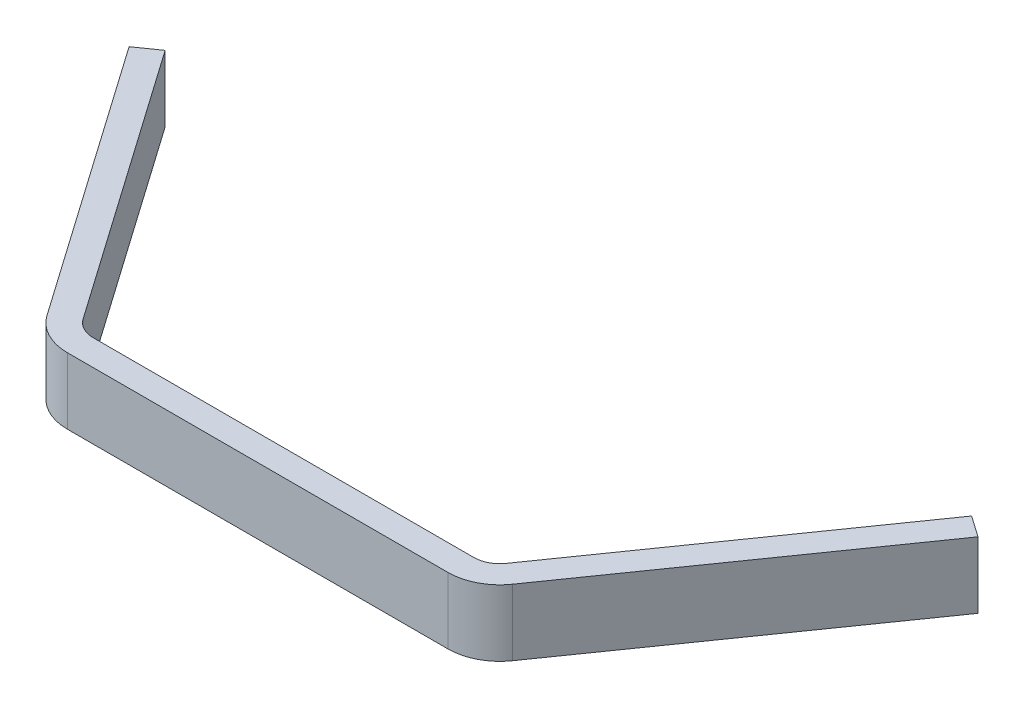
ISO-10303-21;
HEADER;
FILE_DESCRIPTION(('STEP AP214'),'2;1');
FILE_NAME('part.step','',(''),(''),'','','');
FILE_SCHEMA(('AUTOMOTIVE_DESIGN { 1 0 10303 214 1 1 1 1 }'));
ENDSEC;
DATA;
#1=APPLICATION_CONTEXT('core data for automotive mechanical design processes');
#2=APPLICATION_PROTOCOL_DEFINITION('international standard','automotive_design',2000,#1);
#3=PRODUCT_CONTEXT('',#1,'mechanical');
#4=PRODUCT('Part','Part','',(#3));
#5=PRODUCT_RELATED_PRODUCT_CATEGORY('part','',(#4));
#6=PRODUCT_DEFINITION_FORMATION('','',#4);
#7=PRODUCT_DEFINITION_CONTEXT('part definition',#1,'design');
#8=PRODUCT_DEFINITION('design','',#6,#7);
#9=PRODUCT_DEFINITION_SHAPE('','',#8);
#10=(LENGTH_UNIT() NAMED_UNIT(*) SI_UNIT(.MILLI.,.METRE.));
#11=(NAMED_UNIT(*) PLANE_ANGLE_UNIT() SI_UNIT($,.RADIAN.));
#12=(NAMED_UNIT(*) SI_UNIT($,.STERADIAN.) SOLID_ANGLE_UNIT());
#13=UNCERTAINTY_MEASURE_WITH_UNIT(LENGTH_MEASURE(1.E-05),#10,'distance_accuracy_value','');
#14=(GEOMETRIC_REPRESENTATION_CONTEXT(3) GLOBAL_UNCERTAINTY_ASSIGNED_CONTEXT((#13)) GLOBAL_UNIT_ASSIGNED_CONTEXT((#10,
#11,#12)) REPRESENTATION_CONTEXT('',''));
#15=CARTESIAN_POINT('',(0.,0.,0.));
#16=DIRECTION('',(0.,0.,1.));
#17=DIRECTION('',(1.,0.,0.));
#18=AXIS2_PLACEMENT_3D('',#15,#16,#17);
#19=CARTESIAN_POINT('',(23.3382790747957,117.704827001007,-3.175));
#20=DIRECTION('',(0.,-1.,0.));
#21=DIRECTION('',(0.,0.,-1.));
#22=AXIS2_PLACEMENT_3D('',#19,#20,#21);
#23=CYLINDRICAL_SURFACE('',#22,6.35);
#24=CARTESIAN_POINT('',(23.3382790747957,5.58800000000004,-3.175));
#25=DIRECTION('',(0.,1.,0.));
#26=DIRECTION('',(-1.,0.,0.));
#27=AXIS2_PLACEMENT_3D('',#24,#25,#26);
#28=CIRCLE('',#27,6.35);
#29=CARTESIAN_POINT('',(23.3382790747957,5.58800000000004,3.175));
#30=VERTEX_POINT('',#29);
#31=CARTESIAN_POINT('',(28.5398945560308,5.58800000000004,0.467210370829126));
#32=VERTEX_POINT('',#31);
#33=EDGE_CURVE('E140',#30,#32,#28,.T.);
#34=ORIENTED_EDGE('',*,*,#33,.F.);
#35=DIRECTION('',(0.,-1.,0.));
#36=VECTOR('',#35,1.);
#37=CARTESIAN_POINT('',(23.3382790747957,117.704827001007,3.175));
#38=LINE('',#37,#36);
#39=CARTESIAN_POINT('',(23.3382790747957,-2.53999999999997,3.175));
#40=VERTEX_POINT('',#39);
#41=EDGE_CURVE('E39',#30,#40,#38,.T.);
#42=ORIENTED_EDGE('',*,*,#41,.T.);
#43=CARTESIAN_POINT('',(23.3382790747957,-2.53999999999997,-3.175));
#44=DIRECTION('',(0.,-1.,0.));
#45=DIRECTION('',(0.,0.,-1.));
#46=AXIS2_PLACEMENT_3D('',#43,#44,#45);
#47=CIRCLE('',#46,6.35);
#48=CARTESIAN_POINT('',(28.5398945560308,-2.53999999999997,0.467210370829126));
#49=VERTEX_POINT('',#48);
#50=EDGE_CURVE('E181',#40,#49,#47,.F.);
#51=ORIENTED_EDGE('',*,*,#50,.T.);
#52=DIRECTION('',(0.,-1.,0.));
#53=VECTOR('',#52,1.);
#54=CARTESIAN_POINT('',(28.5398945560308,117.704827001007,0.467210370829126));
#55=LINE('',#54,#53);
#56=EDGE_CURVE('E145',#32,#49,#55,.T.);
#57=ORIENTED_EDGE('',*,*,#56,.F.);
#58=EDGE_LOOP('',(#34,#42,#51,#57));
#59=FACE_BOUND('',#58,.T.);
#60=ADVANCED_FACE('F35',(#59),#23,.T.);
#61=CARTESIAN_POINT('',(28.5398945560308,117.704827001007,0.467210370829126));
#62=DIRECTION('',(-0.819152044288991,0.,-0.573576436351047));
#63=DIRECTION('',(-0.573576436351047,0.,0.819152044288991));
#64=AXIS2_PLACEMENT_3D('',#61,#62,#63);
#65=PLANE('',#64);
#66=DIRECTION('',(0.573576436351047,0.,-0.819152044288991));
#67=VECTOR('',#66,1.);
#68=CARTESIAN_POINT('',(28.5398945560308,5.58800000000004,0.46721037082912));
#69=LINE('',#68,#67);
#70=CARTESIAN_POINT('',(52.0466354728892,5.58800000000004,-33.1038948145854));
#71=VERTEX_POINT('',#70);
#72=EDGE_CURVE('E137',#32,#71,#69,.T.);
#73=ORIENTED_EDGE('',*,*,#72,.F.);
#74=ORIENTED_EDGE('',*,*,#56,.T.);
#75=DIRECTION('',(0.573576436351047,0.,-0.819152044288991));
#76=VECTOR('',#75,1.);
#77=CARTESIAN_POINT('',(28.5398945560308,-2.53999999999997,0.467210370829126));
#78=LINE('',#77,#76);
#79=CARTESIAN_POINT('',(52.0466354728892,-2.53999999999997,-33.1038948145854));
#80=VERTEX_POINT('',#79);
#81=EDGE_CURVE('E207',#49,#80,#78,.T.);
#82=ORIENTED_EDGE('',*,*,#81,.T.);
#83=DIRECTION('',(0.,-1.,0.));
#84=VECTOR('',#83,1.);
#85=CARTESIAN_POINT('',(52.0466354728892,117.704827001007,-33.1038948145854));
#86=LINE('',#85,#84);
#87=EDGE_CURVE('E148',#71,#80,#86,.T.);
#88=ORIENTED_EDGE('',*,*,#87,.F.);
#89=EDGE_LOOP('',(#73,#74,#82,#88));
#90=FACE_BOUND('',#89,.T.);
#91=ADVANCED_FACE('F235',(#90),#65,.F.);
#92=CARTESIAN_POINT('',(52.0466354728892,117.704827001007,-33.1038948145854));
#93=DIRECTION('',(-0.573576436351047,0.,0.819152044288991));
#94=DIRECTION('',(0.819152044288991,0.,0.573576436351047));
#95=AXIS2_PLACEMENT_3D('',#92,#93,#94);
#96=PLANE('',#95);
#97=DIRECTION('',(-0.819152044288991,0.,-0.573576436351047));
#98=VECTOR('',#97,1.);
#99=CARTESIAN_POINT('',(52.0466354728892,5.58800000000004,-33.1038948145854));
#100=LINE('',#99,#98);
#101=CARTESIAN_POINT('',(49.4458277322716,5.58800000000004,-34.925));
#102=VERTEX_POINT('',#101);
#103=EDGE_CURVE('E134',#71,#102,#100,.T.);
#104=ORIENTED_EDGE('',*,*,#103,.F.);
#105=ORIENTED_EDGE('',*,*,#87,.T.);
#106=DIRECTION('',(-0.819152044288991,0.,-0.573576436351047));
#107=VECTOR('',#106,1.);
#108=CARTESIAN_POINT('',(52.0466354728892,-2.53999999999997,-33.1038948145854));
#109=LINE('',#108,#107);
#110=CARTESIAN_POINT('',(49.4458277322716,-2.53999999999997,-34.925));
#111=VERTEX_POINT('',#110);
#112=EDGE_CURVE('E205',#80,#111,#109,.T.);
#113=ORIENTED_EDGE('',*,*,#112,.T.);
#114=DIRECTION('',(0.,-1.,0.));
#115=VECTOR('',#114,1.);
#116=CARTESIAN_POINT('',(49.4458277322716,117.704827001007,-34.925));
#117=LINE('',#116,#115);
#118=EDGE_CURVE('E151',#102,#111,#117,.T.);
#119=ORIENTED_EDGE('',*,*,#118,.F.);
#120=EDGE_LOOP('',(#104,#105,#113,#119));
#121=FACE_BOUND('',#120,.T.);
#122=ADVANCED_FACE('F241',(#121),#96,.F.);
#123=CARTESIAN_POINT('',(25.9390868154133,117.704827001007,-1.35389481458544));
#124=DIRECTION('',(0.819152044288992,0.,0.573576436351047));
#125=DIRECTION('',(0.573576436351047,0.,-0.819152044288992));
#126=AXIS2_PLACEMENT_3D('',#123,#124,#125);
#127=PLANE('',#126);
#128=DIRECTION('',(-0.573576436351047,0.,0.819152044288992));
#129=VECTOR('',#128,1.);
#130=CARTESIAN_POINT('',(25.9390868154133,5.58800000000004,-1.35389481458544));
#131=LINE('',#130,#129);
#132=CARTESIAN_POINT('',(25.9390868154133,5.58800000000004,-1.35389481458544));
#133=VERTEX_POINT('',#132);
#134=EDGE_CURVE('E131',#102,#133,#131,.T.);
#135=ORIENTED_EDGE('',*,*,#134,.F.);
#136=ORIENTED_EDGE('',*,*,#118,.T.);
#137=DIRECTION('',(-0.573576436351047,0.,0.819152044288992));
#138=VECTOR('',#137,1.);
#139=CARTESIAN_POINT('',(25.9390868154133,-2.53999999999997,-1.35389481458544));
#140=LINE('',#139,#138);
#141=CARTESIAN_POINT('',(25.9390868154133,-2.53999999999997,-1.35389481458544));
#142=VERTEX_POINT('',#141);
#143=EDGE_CURVE('E202',#111,#142,#140,.T.);
#144=ORIENTED_EDGE('',*,*,#143,.T.);
#145=DIRECTION('',(0.,-1.,0.));
#146=VECTOR('',#145,1.);
#147=CARTESIAN_POINT('',(25.9390868154133,117.704827001007,-1.35389481458544));
#148=LINE('',#147,#146);
#149=EDGE_CURVE('E154',#133,#142,#148,.T.);
#150=ORIENTED_EDGE('',*,*,#149,.F.);
#151=EDGE_LOOP('',(#135,#136,#144,#150));
#152=FACE_BOUND('',#151,.T.);
#153=ADVANCED_FACE('F239',(#152),#127,.F.);
#154=CARTESIAN_POINT('',(23.3382790747957,117.704827001007,-3.175));
#155=DIRECTION('',(0.,-1.,0.));
#156=DIRECTION('',(0.,0.,-1.));
#157=AXIS2_PLACEMENT_3D('',#154,#155,#156);
#158=CYLINDRICAL_SURFACE('',#157,3.175);
#159=CARTESIAN_POINT('',(23.3382790747957,5.58800000000004,-3.175));
#160=DIRECTION('',(0.,1.,0.));
#161=DIRECTION('',(-1.,0.,0.));
#162=AXIS2_PLACEMENT_3D('',#159,#160,#161);
#163=CIRCLE('',#162,3.175);
#164=CARTESIAN_POINT('',(23.3382790747957,5.58800000000004,0.));
#165=VERTEX_POINT('',#164);
#166=EDGE_CURVE('E128',#133,#165,#163,.F.);
#167=ORIENTED_EDGE('',*,*,#166,.F.);
#168=ORIENTED_EDGE('',*,*,#149,.T.);
#169=CARTESIAN_POINT('',(23.3382790747957,-2.53999999999997,-3.175));
#170=DIRECTION('',(0.,-1.,0.));
#171=DIRECTION('',(0.,0.,-1.));
#172=AXIS2_PLACEMENT_3D('',#169,#170,#171);
#173=CIRCLE('',#172,3.175);
#174=CARTESIAN_POINT('',(23.3382790747957,-2.53999999999997,0.));
#175=VERTEX_POINT('',#174);
#176=EDGE_CURVE('E199',#142,#175,#173,.T.);
#177=ORIENTED_EDGE('',*,*,#176,.T.);
#178=DIRECTION('',(0.,-1.,0.));
#179=VECTOR('',#178,1.);
#180=CARTESIAN_POINT('',(23.3382790747957,117.704827001007,0.));
#181=LINE('',#180,#179);
#182=EDGE_CURVE('E157',#165,#175,#181,.T.);
#183=ORIENTED_EDGE('',*,*,#182,.F.);
#184=EDGE_LOOP('',(#167,#168,#177,#183));
#185=FACE_BOUND('',#184,.T.);
#186=ADVANCED_FACE('F248',(#185),#158,.F.);
#187=CARTESIAN_POINT('',(-23.3382790747957,117.704827001007,0.));
#188=DIRECTION('',(0.,0.,1.));
#189=DIRECTION('',(1.,0.,0.));
#190=AXIS2_PLACEMENT_3D('',#187,#188,#189);
#191=PLANE('',#190);
#192=DIRECTION('',(-1.,0.,0.));
#193=VECTOR('',#192,1.);
#194=CARTESIAN_POINT('',(-23.3382790747957,5.58800000000004,0.));
#195=LINE('',#194,#193);
#196=CARTESIAN_POINT('',(-23.3382790747957,5.58800000000004,0.));
#197=VERTEX_POINT('',#196);
#198=EDGE_CURVE('E125',#165,#197,#195,.T.);
#199=ORIENTED_EDGE('',*,*,#198,.F.);
#200=ORIENTED_EDGE('',*,*,#182,.T.);
#201=DIRECTION('',(-1.,0.,0.));
#202=VECTOR('',#201,1.);
#203=CARTESIAN_POINT('',(-23.3382790747957,-2.53999999999997,0.));
#204=LINE('',#203,#202);
#205=CARTESIAN_POINT('',(-23.3382790747957,-2.53999999999997,0.));
#206=VERTEX_POINT('',#205);
#207=EDGE_CURVE('E196',#175,#206,#204,.T.);
#208=ORIENTED_EDGE('',*,*,#207,.T.);
#209=DIRECTION('',(0.,-1.,0.));
#210=VECTOR('',#209,1.);
#211=CARTESIAN_POINT('',(-23.3382790747957,117.704827001007,0.));
#212=LINE('',#211,#210);
#213=EDGE_CURVE('E160',#197,#206,#212,.T.);
#214=ORIENTED_EDGE('',*,*,#213,.F.);
#215=EDGE_LOOP('',(#199,#200,#208,#214));
#216=FACE_BOUND('',#215,.T.);
#217=ADVANCED_FACE('F277',(#216),#191,.F.);
#218=CARTESIAN_POINT('',(-23.3382790747957,117.704827001007,-3.175));
#219=DIRECTION('',(0.,-1.,0.));
#220=DIRECTION('',(0.,0.,-1.));
#221=AXIS2_PLACEMENT_3D('',#218,#219,#220);
#222=CYLINDRICAL_SURFACE('',#221,3.175);
#223=CARTESIAN_POINT('',(-23.3382790747957,5.58800000000004,-3.175));
#224=DIRECTION('',(0.,1.,0.));
#225=DIRECTION('',(-1.,0.,0.));
#226=AXIS2_PLACEMENT_3D('',#223,#224,#225);
#227=CIRCLE('',#226,3.175);
#228=CARTESIAN_POINT('',(-25.9390868154133,5.58800000000004,-1.35389481458545));
#229=VERTEX_POINT('',#228);
#230=EDGE_CURVE('E121',#197,#229,#227,.F.);
#231=ORIENTED_EDGE('',*,*,#230,.F.);
#232=ORIENTED_EDGE('',*,*,#213,.T.);
#233=CARTESIAN_POINT('',(-23.3382790747957,-2.53999999999997,-3.175));
#234=DIRECTION('',(0.,-1.,0.));
#235=DIRECTION('',(0.,0.,-1.));
#236=AXIS2_PLACEMENT_3D('',#233,#234,#235);
#237=CIRCLE('',#236,3.175);
#238=CARTESIAN_POINT('',(-25.9390868154133,-2.53999999999997,-1.35389481458545));
#239=VERTEX_POINT('',#238);
#240=EDGE_CURVE('E193',#206,#239,#237,.T.);
#241=ORIENTED_EDGE('',*,*,#240,.T.);
#242=DIRECTION('',(0.,-1.,0.));
#243=VECTOR('',#242,1.);
#244=CARTESIAN_POINT('',(-25.9390868154133,117.704827001007,-1.35389481458545));
#245=LINE('',#244,#243);
#246=EDGE_CURVE('E163',#229,#239,#245,.T.);
#247=ORIENTED_EDGE('',*,*,#246,.F.);
#248=EDGE_LOOP('',(#231,#232,#241,#247));
#249=FACE_BOUND('',#248,.T.);
#250=ADVANCED_FACE('F286',(#249),#222,.F.);
#251=CARTESIAN_POINT('',(-49.4458277322716,117.704827001007,-34.925));
#252=DIRECTION('',(-0.819152044288991,0.,0.573576436351047));
#253=DIRECTION('',(0.573576436351047,0.,0.819152044288991));
#254=AXIS2_PLACEMENT_3D('',#251,#252,#253);
#255=PLANE('',#254);
#256=DIRECTION('',(-0.573576436351047,0.,-0.819152044288991));
#257=VECTOR('',#256,1.);
#258=CARTESIAN_POINT('',(-49.4458277322716,5.58800000000004,-34.925));
#259=LINE('',#258,#257);
#260=CARTESIAN_POINT('',(-49.4458277322716,5.58800000000004,-34.925));
#261=VERTEX_POINT('',#260);
#262=EDGE_CURVE('E119',#229,#261,#259,.T.);
#263=ORIENTED_EDGE('',*,*,#262,.F.);
#264=ORIENTED_EDGE('',*,*,#246,.T.);
#265=DIRECTION('',(-0.573576436351047,0.,-0.819152044288991));
#266=VECTOR('',#265,1.);
#267=CARTESIAN_POINT('',(-49.4458277322716,-2.53999999999997,-34.925));
#268=LINE('',#267,#266);
#269=CARTESIAN_POINT('',(-49.4458277322716,-2.53999999999997,-34.925));
#270=VERTEX_POINT('',#269);
#271=EDGE_CURVE('E190',#239,#270,#268,.T.);
#272=ORIENTED_EDGE('',*,*,#271,.T.);
#273=DIRECTION('',(0.,-1.,0.));
#274=VECTOR('',#273,1.);
#275=CARTESIAN_POINT('',(-49.4458277322716,117.704827001007,-34.925));
#276=LINE('',#275,#274);
#277=EDGE_CURVE('E114',#261,#270,#276,.T.);
#278=ORIENTED_EDGE('',*,*,#277,.F.);
#279=EDGE_LOOP('',(#263,#264,#272,#278));
#280=FACE_BOUND('',#279,.T.);
#281=ADVANCED_FACE('F296',(#280),#255,.F.);
#282=CARTESIAN_POINT('',(-52.0466354728892,117.704827001007,-33.1038948145854));
#283=DIRECTION('',(0.573576436351047,0.,0.819152044288991));
#284=DIRECTION('',(0.819152044288991,0.,-0.573576436351047));
#285=AXIS2_PLACEMENT_3D('',#282,#283,#284);
#286=PLANE('',#285);
#287=DIRECTION('',(-0.819152044288991,0.,0.573576436351047));
#288=VECTOR('',#287,1.);
#289=CARTESIAN_POINT('',(-52.0466354728892,5.58800000000004,-33.1038948145854));
#290=LINE('',#289,#288);
#291=CARTESIAN_POINT('',(-52.0466354728892,5.58800000000004,-33.1038948145854));
#292=VERTEX_POINT('',#291);
#293=EDGE_CURVE('E105',#261,#292,#290,.T.);
#294=ORIENTED_EDGE('',*,*,#293,.F.);
#295=ORIENTED_EDGE('',*,*,#277,.T.);
#296=DIRECTION('',(-0.819152044288991,0.,0.573576436351047));
#297=VECTOR('',#296,1.);
#298=CARTESIAN_POINT('',(-52.0466354728892,-2.53999999999997,-33.1038948145854));
#299=LINE('',#298,#297);
#300=CARTESIAN_POINT('',(-52.0466354728892,-2.53999999999997,-33.1038948145854));
#301=VERTEX_POINT('',#300);
#302=EDGE_CURVE('E113',#270,#301,#299,.T.);
#303=ORIENTED_EDGE('',*,*,#302,.T.);
#304=DIRECTION('',(0.,-1.,0.));
#305=VECTOR('',#304,1.);
#306=CARTESIAN_POINT('',(-52.0466354728892,117.704827001007,-33.1038948145854));
#307=LINE('',#306,#305);
#308=EDGE_CURVE('E99',#292,#301,#307,.T.);
#309=ORIENTED_EDGE('',*,*,#308,.F.);
#310=EDGE_LOOP('',(#294,#295,#303,#309));
#311=FACE_BOUND('',#310,.T.);
#312=ADVANCED_FACE('F109',(#311),#286,.F.);
#313=CARTESIAN_POINT('',(-52.0466354728892,117.704827001007,-33.1038948145854));
#314=DIRECTION('',(0.819152044288991,0.,-0.573576436351047));
#315=DIRECTION('',(-0.573576436351047,0.,-0.819152044288991));
#316=AXIS2_PLACEMENT_3D('',#313,#314,#315);
#317=PLANE('',#316);
#318=DIRECTION('',(0.573576436351047,0.,0.819152044288991));
#319=VECTOR('',#318,1.);
#320=CARTESIAN_POINT('',(-52.0466354728892,5.58800000000004,-33.1038948145854));
#321=LINE('',#320,#319);
#322=CARTESIAN_POINT('',(-28.5398945560308,5.58800000000004,0.467210370829129));
#323=VERTEX_POINT('',#322);
#324=EDGE_CURVE('E44',#292,#323,#321,.T.);
#325=ORIENTED_EDGE('',*,*,#324,.F.);
#326=ORIENTED_EDGE('',*,*,#308,.T.);
#327=DIRECTION('',(0.573576436351047,0.,0.819152044288991));
#328=VECTOR('',#327,1.);
#329=CARTESIAN_POINT('',(-52.0466354728892,-2.53999999999997,-33.1038948145854));
#330=LINE('',#329,#328);
#331=CARTESIAN_POINT('',(-28.5398945560308,-2.53999999999997,0.467210370829127));
#332=VERTEX_POINT('',#331);
#333=EDGE_CURVE('E184',#301,#332,#330,.T.);
#334=ORIENTED_EDGE('',*,*,#333,.T.);
#335=DIRECTION('',(0.,-1.,0.));
#336=VECTOR('',#335,1.);
#337=CARTESIAN_POINT('',(-28.5398945560308,117.704827001007,0.467210370829129));
#338=LINE('',#337,#336);
#339=EDGE_CURVE('E102',#323,#332,#338,.T.);
#340=ORIENTED_EDGE('',*,*,#339,.F.);
#341=EDGE_LOOP('',(#325,#326,#334,#340));
#342=FACE_BOUND('',#341,.T.);
#343=ADVANCED_FACE('F96',(#342),#317,.F.);
#344=CARTESIAN_POINT('',(-23.3382790747957,117.704827001007,-3.175));
#345=DIRECTION('',(0.,-1.,0.));
#346=DIRECTION('',(0.,0.,-1.));
#347=AXIS2_PLACEMENT_3D('',#344,#345,#346);
#348=CYLINDRICAL_SURFACE('',#347,6.35);
#349=CARTESIAN_POINT('',(-23.3382790747957,5.58800000000004,-3.175));
#350=DIRECTION('',(0.,1.,0.));
#351=DIRECTION('',(-1.,0.,0.));
#352=AXIS2_PLACEMENT_3D('',#349,#350,#351);
#353=CIRCLE('',#352,6.35);
#354=CARTESIAN_POINT('',(-23.3382790747957,5.58800000000004,3.175));
#355=VERTEX_POINT('',#354);
#356=EDGE_CURVE('E12',#323,#355,#353,.T.);
#357=ORIENTED_EDGE('',*,*,#356,.F.);
#358=ORIENTED_EDGE('',*,*,#339,.T.);
#359=CARTESIAN_POINT('',(-23.3382790747957,-2.53999999999997,-3.175));
#360=DIRECTION('',(0.,-1.,0.));
#361=DIRECTION('',(0.,0.,-1.));
#362=AXIS2_PLACEMENT_3D('',#359,#360,#361);
#363=CIRCLE('',#362,6.35);
#364=CARTESIAN_POINT('',(-23.3382790747957,-2.53999999999997,3.175));
#365=VERTEX_POINT('',#364);
#366=EDGE_CURVE('E178',#332,#365,#363,.F.);
#367=ORIENTED_EDGE('',*,*,#366,.T.);
#368=DIRECTION('',(0.,-1.,0.));
#369=VECTOR('',#368,1.);
#370=CARTESIAN_POINT('',(-23.3382790747957,117.704827001007,3.175));
#371=LINE('',#370,#369);
#372=EDGE_CURVE('E60',#355,#365,#371,.T.);
#373=ORIENTED_EDGE('',*,*,#372,.F.);
#374=EDGE_LOOP('',(#357,#358,#367,#373));
#375=FACE_BOUND('',#374,.T.);
#376=ADVANCED_FACE('F183',(#375),#348,.T.);
#377=CARTESIAN_POINT('',(-23.3382790747957,117.704827001007,3.175));
#378=DIRECTION('',(0.,0.,-1.));
#379=DIRECTION('',(-1.,0.,0.));
#380=AXIS2_PLACEMENT_3D('',#377,#378,#379);
#381=PLANE('',#380);
#382=DIRECTION('',(1.,0.,0.));
#383=VECTOR('',#382,1.);
#384=CARTESIAN_POINT('',(-23.3382790747957,5.58800000000004,3.175));
#385=LINE('',#384,#383);
#386=EDGE_CURVE('E143',#355,#30,#385,.T.);
#387=ORIENTED_EDGE('',*,*,#386,.F.);
#388=ORIENTED_EDGE('',*,*,#372,.T.);
#389=DIRECTION('',(1.,0.,0.));
#390=VECTOR('',#389,1.);
#391=CARTESIAN_POINT('',(-23.3382790747957,-2.53999999999997,3.175));
#392=LINE('',#391,#390);
#393=EDGE_CURVE('E171',#365,#40,#392,.T.);
#394=ORIENTED_EDGE('',*,*,#393,.T.);
#395=ORIENTED_EDGE('',*,*,#41,.F.);
#396=EDGE_LOOP('',(#387,#388,#394,#395));
#397=FACE_BOUND('',#396,.T.);
#398=ADVANCED_FACE('F169',(#397),#381,.F.);
#399=CARTESIAN_POINT('',(0.,5.58800000000003,-59.055));
#400=DIRECTION('',(0.,1.,0.));
#401=DIRECTION('',(0.,0.,1.));
#402=AXIS2_PLACEMENT_3D('',#399,#400,#401);
#403=PLANE('',#402);
#404=ORIENTED_EDGE('',*,*,#386,.T.);
#405=ORIENTED_EDGE('',*,*,#33,.T.);
#406=ORIENTED_EDGE('',*,*,#72,.T.);
#407=ORIENTED_EDGE('',*,*,#103,.T.);
#408=ORIENTED_EDGE('',*,*,#134,.T.);
#409=ORIENTED_EDGE('',*,*,#166,.T.);
#410=ORIENTED_EDGE('',*,*,#198,.T.);
#411=ORIENTED_EDGE('',*,*,#230,.T.);
#412=ORIENTED_EDGE('',*,*,#262,.T.);
#413=ORIENTED_EDGE('',*,*,#293,.T.);
#414=ORIENTED_EDGE('',*,*,#324,.T.);
#415=ORIENTED_EDGE('',*,*,#356,.T.);
#416=EDGE_LOOP('',(#404,#405,#406,#407,#408,#409,#410,#411,#412,#413,#414,#415));
#417=FACE_BOUND('',#416,.T.);
#418=ADVANCED_FACE('F37',(#417),#403,.T.);
#419=CARTESIAN_POINT('',(0.,-2.53999999999997,-59.055));
#420=DIRECTION('',(0.,-1.,0.));
#421=DIRECTION('',(0.,0.,1.));
#422=AXIS2_PLACEMENT_3D('',#419,#420,#421);
#423=PLANE('',#422);
#424=ORIENTED_EDGE('',*,*,#50,.F.);
#425=ORIENTED_EDGE('',*,*,#393,.F.);
#426=ORIENTED_EDGE('',*,*,#366,.F.);
#427=ORIENTED_EDGE('',*,*,#333,.F.);
#428=ORIENTED_EDGE('',*,*,#302,.F.);
#429=ORIENTED_EDGE('',*,*,#271,.F.);
#430=ORIENTED_EDGE('',*,*,#240,.F.);
#431=ORIENTED_EDGE('',*,*,#207,.F.);
#432=ORIENTED_EDGE('',*,*,#176,.F.);
#433=ORIENTED_EDGE('',*,*,#143,.F.);
#434=ORIENTED_EDGE('',*,*,#112,.F.);
#435=ORIENTED_EDGE('',*,*,#81,.F.);
#436=EDGE_LOOP('',(#424,#425,#426,#427,#428,#429,#430,#431,#432,#433,#434,#435));
#437=FACE_BOUND('',#436,.T.);
#438=ADVANCED_FACE('F177',(#437),#423,.T.);
#439=CLOSED_SHELL('',(#60,#91,#122,#153,#186,#217,#250,#281,#312,#343,#376,#398,#418,#438));
#440=MANIFOLD_SOLID_BREP('B2',#439);
#441=ADVANCED_BREP_SHAPE_REPRESENTATION('',(#18,#440),#14);
#442=SHAPE_DEFINITION_REPRESENTATION(#9,#441);
ENDSEC;
END-ISO-10303-21;
